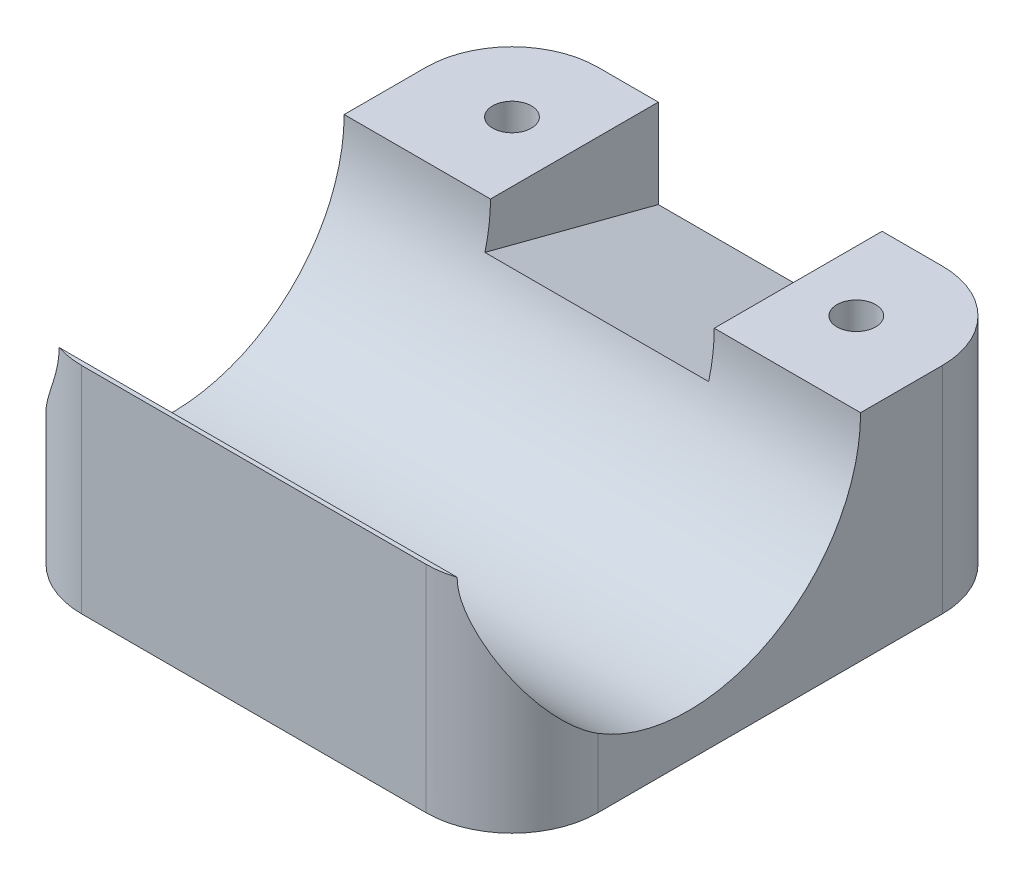
ISO-10303-21;
HEADER;
FILE_DESCRIPTION(('STEP AP214'),'2;1');
FILE_NAME('part.step','',(''),(''),'','','');
FILE_SCHEMA(('AUTOMOTIVE_DESIGN { 1 0 10303 214 1 1 1 1 }'));
ENDSEC;
DATA;
#1=APPLICATION_CONTEXT('core data for automotive mechanical design processes');
#2=APPLICATION_PROTOCOL_DEFINITION('international standard','automotive_design',2000,#1);
#3=PRODUCT_CONTEXT('',#1,'mechanical');
#4=PRODUCT('Part','Part','',(#3));
#5=PRODUCT_RELATED_PRODUCT_CATEGORY('part','',(#4));
#6=PRODUCT_DEFINITION_FORMATION('','',#4);
#7=PRODUCT_DEFINITION_CONTEXT('part definition',#1,'design');
#8=PRODUCT_DEFINITION('design','',#6,#7);
#9=PRODUCT_DEFINITION_SHAPE('','',#8);
#10=(LENGTH_UNIT() NAMED_UNIT(*) SI_UNIT(.MILLI.,.METRE.));
#11=(NAMED_UNIT(*) PLANE_ANGLE_UNIT() SI_UNIT($,.RADIAN.));
#12=(NAMED_UNIT(*) SI_UNIT($,.STERADIAN.) SOLID_ANGLE_UNIT());
#13=UNCERTAINTY_MEASURE_WITH_UNIT(LENGTH_MEASURE(1.E-05),#10,'distance_accuracy_value','');
#14=(GEOMETRIC_REPRESENTATION_CONTEXT(3) GLOBAL_UNCERTAINTY_ASSIGNED_CONTEXT((#13)) GLOBAL_UNIT_ASSIGNED_CONTEXT((#10,
#11,#12)) REPRESENTATION_CONTEXT('',''));
#15=CARTESIAN_POINT('',(0.,0.,0.));
#16=DIRECTION('',(0.,0.,1.));
#17=DIRECTION('',(1.,0.,0.));
#18=AXIS2_PLACEMENT_3D('',#15,#16,#17);
#19=CARTESIAN_POINT('',(0.,25.,0.));
#20=DIRECTION('',(0.,1.,0.));
#21=DIRECTION('',(-1.,0.,0.));
#22=AXIS2_PLACEMENT_3D('',#19,#20,#21);
#23=PLANE('',#22);
#24=CARTESIAN_POINT('',(50.,25.,-50.));
#25=DIRECTION('',(0.,1.,0.));
#26=DIRECTION('',(-1.,0.,0.));
#27=AXIS2_PLACEMENT_3D('',#24,#25,#26);
#28=CIRCLE('',#27,2.25);
#29=CARTESIAN_POINT('',(47.75,25.,-50.));
#30=VERTEX_POINT('',#29);
#31=EDGE_CURVE('E220',#30,#30,#28,.T.);
#32=ORIENTED_EDGE('',*,*,#31,.F.);
#33=EDGE_LOOP('',(#32));
#34=FACE_BOUND('',#33,.T.);
#35=DIRECTION('',(0.,0.,-1.));
#36=VECTOR('',#35,1.);
#37=CARTESIAN_POINT('',(60.,25.,0.));
#38=LINE('',#37,#36);
#39=CARTESIAN_POINT('',(60.,25.,-40.5000000000002));
#40=VERTEX_POINT('',#39);
#41=CARTESIAN_POINT('',(60.,25.,-50.));
#42=VERTEX_POINT('',#41);
#43=EDGE_CURVE('E250',#40,#42,#38,.T.);
#44=ORIENTED_EDGE('',*,*,#43,.T.);
#45=CARTESIAN_POINT('',(50.,25.,-50.));
#46=DIRECTION('',(0.,1.,0.));
#47=DIRECTION('',(-1.,0.,0.));
#48=AXIS2_PLACEMENT_3D('',#45,#46,#47);
#49=CIRCLE('',#48,10.);
#50=CARTESIAN_POINT('',(50.,25.,-60.));
#51=VERTEX_POINT('',#50);
#52=EDGE_CURVE('E56',#42,#51,#49,.T.);
#53=ORIENTED_EDGE('',*,*,#52,.T.);
#54=DIRECTION('',(-1.,0.,0.));
#55=VECTOR('',#54,1.);
#56=CARTESIAN_POINT('',(0.,25.,-60.));
#57=LINE('',#56,#55);
#58=CARTESIAN_POINT('',(43.,25.,-60.));
#59=VERTEX_POINT('',#58);
#60=EDGE_CURVE('E248',#51,#59,#57,.T.);
#61=ORIENTED_EDGE('',*,*,#60,.T.);
#62=DIRECTION('',(0.,0.,1.));
#63=VECTOR('',#62,1.);
#64=CARTESIAN_POINT('',(43.,25.,0.));
#65=LINE('',#64,#63);
#66=CARTESIAN_POINT('',(43.,25.,-40.5000000000002));
#67=VERTEX_POINT('',#66);
#68=EDGE_CURVE('E195',#59,#67,#65,.T.);
#69=ORIENTED_EDGE('',*,*,#68,.T.);
#70=DIRECTION('',(-1.,0.,0.));
#71=VECTOR('',#70,1.);
#72=CARTESIAN_POINT('',(111.219821336558,25.,-40.5000000000002));
#73=LINE('',#72,#71);
#74=EDGE_CURVE('E244',#40,#67,#73,.T.);
#75=ORIENTED_EDGE('',*,*,#74,.F.);
#76=EDGE_LOOP('',(#44,#53,#61,#69,#75));
#77=FACE_BOUND('',#76,.T.);
#78=ADVANCED_FACE('F46',(#34,#77),#23,.T.);
#79=CARTESIAN_POINT('',(10.,25.,-50.));
#80=DIRECTION('',(0.,1.,0.));
#81=DIRECTION('',(-1.,0.,0.));
#82=AXIS2_PLACEMENT_3D('',#79,#80,#81);
#83=CIRCLE('',#82,2.25);
#84=CARTESIAN_POINT('',(7.75,25.,-50.));
#85=VERTEX_POINT('',#84);
#86=EDGE_CURVE('E215',#85,#85,#83,.T.);
#87=ORIENTED_EDGE('',*,*,#86,.F.);
#88=EDGE_LOOP('',(#87));
#89=FACE_BOUND('',#88,.T.);
#90=CARTESIAN_POINT('',(17.,25.,-60.));
#91=VERTEX_POINT('',#90);
#92=CARTESIAN_POINT('',(10.,25.,-60.));
#93=VERTEX_POINT('',#92);
#94=EDGE_CURVE('E154',#91,#93,#57,.T.);
#95=ORIENTED_EDGE('',*,*,#94,.T.);
#96=CARTESIAN_POINT('',(10.,25.,-50.));
#97=DIRECTION('',(0.,1.,0.));
#98=DIRECTION('',(-1.,0.,0.));
#99=AXIS2_PLACEMENT_3D('',#96,#97,#98);
#100=CIRCLE('',#99,10.);
#101=CARTESIAN_POINT('',(0.,25.,-50.));
#102=VERTEX_POINT('',#101);
#103=EDGE_CURVE('E13',#93,#102,#100,.T.);
#104=ORIENTED_EDGE('',*,*,#103,.T.);
#105=DIRECTION('',(0.,0.,1.));
#106=VECTOR('',#105,1.);
#107=CARTESIAN_POINT('',(0.,25.,0.));
#108=LINE('',#107,#106);
#109=CARTESIAN_POINT('',(0.,25.,-40.5000000000002));
#110=VERTEX_POINT('',#109);
#111=EDGE_CURVE('E104',#102,#110,#108,.T.);
#112=ORIENTED_EDGE('',*,*,#111,.T.);
#113=CARTESIAN_POINT('',(17.,25.,-40.5000000000002));
#114=VERTEX_POINT('',#113);
#115=EDGE_CURVE('E247',#114,#110,#73,.T.);
#116=ORIENTED_EDGE('',*,*,#115,.F.);
#117=DIRECTION('',(0.,0.,1.));
#118=VECTOR('',#117,1.);
#119=CARTESIAN_POINT('',(17.,25.,0.));
#120=LINE('',#119,#118);
#121=EDGE_CURVE('E194',#91,#114,#120,.T.);
#122=ORIENTED_EDGE('',*,*,#121,.F.);
#123=EDGE_LOOP('',(#95,#104,#112,#116,#122));
#124=FACE_BOUND('',#123,.T.);
#125=ADVANCED_FACE('F151',(#89,#124),#23,.T.);
#126=DIRECTION('',(1.,0.,0.));
#127=VECTOR('',#126,1.);
#128=CARTESIAN_POINT('',(0.,25.,0.));
#129=LINE('',#128,#127);
#130=CARTESIAN_POINT('',(10.,25.,0.));
#131=VERTEX_POINT('',#130);
#132=CARTESIAN_POINT('',(50.,25.,0.));
#133=VERTEX_POINT('',#132);
#134=EDGE_CURVE('E167',#131,#133,#129,.T.);
#135=ORIENTED_EDGE('',*,*,#134,.T.);
#136=CARTESIAN_POINT('',(50.,25.,-10.));
#137=DIRECTION('',(0.,1.,0.));
#138=DIRECTION('',(-1.,0.,0.));
#139=AXIS2_PLACEMENT_3D('',#136,#137,#138);
#140=CIRCLE('',#139,10.);
#141=CARTESIAN_POINT('',(53.1224989991997,25.,-0.500000000000164));
#142=VERTEX_POINT('',#141);
#143=EDGE_CURVE('E275',#133,#142,#140,.T.);
#144=ORIENTED_EDGE('',*,*,#143,.T.);
#145=DIRECTION('',(-1.,0.,0.));
#146=VECTOR('',#145,1.);
#147=CARTESIAN_POINT('',(111.219821336558,25.,-0.500000000000164));
#148=LINE('',#147,#146);
#149=CARTESIAN_POINT('',(6.8775010008003,25.,-0.500000000000164));
#150=VERTEX_POINT('',#149);
#151=EDGE_CURVE('E240',#150,#142,#148,.F.);
#152=ORIENTED_EDGE('',*,*,#151,.F.);
#153=CARTESIAN_POINT('',(10.,25.,-10.));
#154=DIRECTION('',(0.,1.,0.));
#155=DIRECTION('',(-1.,0.,0.));
#156=AXIS2_PLACEMENT_3D('',#153,#154,#155);
#157=CIRCLE('',#156,10.);
#158=EDGE_CURVE('E273',#150,#131,#157,.T.);
#159=ORIENTED_EDGE('',*,*,#158,.T.);
#160=EDGE_LOOP('',(#135,#144,#152,#159));
#161=FACE_BOUND('',#160,.T.);
#162=ADVANCED_FACE('F307',(#161),#23,.T.);
#163=CARTESIAN_POINT('',(0.,80.,0.));
#164=DIRECTION('',(0.,0.,-1.));
#165=DIRECTION('',(-1.,0.,0.));
#166=AXIS2_PLACEMENT_3D('',#163,#164,#165);
#167=PLANE('',#166);
#168=DIRECTION('',(1.,0.,0.));
#169=VECTOR('',#168,1.);
#170=CARTESIAN_POINT('',(0.,0.,0.));
#171=LINE('',#170,#169);
#172=CARTESIAN_POINT('',(10.,0.,0.));
#173=VERTEX_POINT('',#172);
#174=CARTESIAN_POINT('',(50.,0.,0.));
#175=VERTEX_POINT('',#174);
#176=EDGE_CURVE('E231',#173,#175,#171,.T.);
#177=ORIENTED_EDGE('',*,*,#176,.T.);
#178=DIRECTION('',(0.,-1.,0.));
#179=VECTOR('',#178,1.);
#180=CARTESIAN_POINT('',(50.,80.,0.));
#181=LINE('',#180,#179);
#182=EDGE_CURVE('E271',#175,#133,#181,.F.);
#183=ORIENTED_EDGE('',*,*,#182,.T.);
#184=ORIENTED_EDGE('',*,*,#134,.F.);
#185=DIRECTION('',(0.,-1.,0.));
#186=VECTOR('',#185,1.);
#187=CARTESIAN_POINT('',(10.,80.,0.));
#188=LINE('',#187,#186);
#189=EDGE_CURVE('E268',#131,#173,#188,.T.);
#190=ORIENTED_EDGE('',*,*,#189,.T.);
#191=EDGE_LOOP('',(#177,#183,#184,#190));
#192=FACE_BOUND('',#191,.T.);
#193=ADVANCED_FACE('F311',(#192),#167,.F.);
#194=CARTESIAN_POINT('',(0.,0.,0.));
#195=DIRECTION('',(0.,-1.,0.));
#196=DIRECTION('',(0.,0.,-1.));
#197=AXIS2_PLACEMENT_3D('',#194,#195,#196);
#198=PLANE('',#197);
#199=CARTESIAN_POINT('',(9.99999999999999,0.,-50.));
#200=DIRECTION('',(0.,-1.,0.));
#201=DIRECTION('',(0.,0.,-1.));
#202=AXIS2_PLACEMENT_3D('',#199,#200,#201);
#203=CIRCLE('',#202,2.25);
#204=CARTESIAN_POINT('',(9.99999999999999,0.,-52.25));
#205=VERTEX_POINT('',#204);
#206=EDGE_CURVE('E50',#205,#205,#203,.T.);
#207=ORIENTED_EDGE('',*,*,#206,.F.);
#208=EDGE_LOOP('',(#207));
#209=FACE_BOUND('',#208,.T.);
#210=CARTESIAN_POINT('',(50.,0.,-50.));
#211=DIRECTION('',(0.,-1.,0.));
#212=DIRECTION('',(0.,0.,-1.));
#213=AXIS2_PLACEMENT_3D('',#210,#211,#212);
#214=CIRCLE('',#213,2.25);
#215=CARTESIAN_POINT('',(50.,0.,-52.25));
#216=VERTEX_POINT('',#215);
#217=EDGE_CURVE('E213',#216,#216,#214,.T.);
#218=ORIENTED_EDGE('',*,*,#217,.F.);
#219=EDGE_LOOP('',(#218));
#220=FACE_BOUND('',#219,.T.);
#221=DIRECTION('',(0.,0.,-1.));
#222=VECTOR('',#221,1.);
#223=CARTESIAN_POINT('',(60.,0.,0.));
#224=LINE('',#223,#222);
#225=CARTESIAN_POINT('',(60.,0.,-10.));
#226=VERTEX_POINT('',#225);
#227=CARTESIAN_POINT('',(60.,0.,-50.));
#228=VERTEX_POINT('',#227);
#229=EDGE_CURVE('E234',#226,#228,#224,.T.);
#230=ORIENTED_EDGE('',*,*,#229,.F.);
#231=CARTESIAN_POINT('',(50.,0.,-10.));
#232=DIRECTION('',(0.,-1.,0.));
#233=DIRECTION('',(0.,0.,-1.));
#234=AXIS2_PLACEMENT_3D('',#231,#232,#233);
#235=CIRCLE('',#234,10.);
#236=EDGE_CURVE('E266',#226,#175,#235,.T.);
#237=ORIENTED_EDGE('',*,*,#236,.T.);
#238=ORIENTED_EDGE('',*,*,#176,.F.);
#239=CARTESIAN_POINT('',(10.,0.,-10.));
#240=DIRECTION('',(0.,-1.,0.));
#241=DIRECTION('',(0.,0.,-1.));
#242=AXIS2_PLACEMENT_3D('',#239,#240,#241);
#243=CIRCLE('',#242,10.);
#244=CARTESIAN_POINT('',(0.,0.,-10.));
#245=VERTEX_POINT('',#244);
#246=EDGE_CURVE('E264',#173,#245,#243,.T.);
#247=ORIENTED_EDGE('',*,*,#246,.T.);
#248=DIRECTION('',(0.,0.,1.));
#249=VECTOR('',#248,1.);
#250=CARTESIAN_POINT('',(0.,0.,0.));
#251=LINE('',#250,#249);
#252=CARTESIAN_POINT('',(0.,0.,-50.));
#253=VERTEX_POINT('',#252);
#254=EDGE_CURVE('E229',#253,#245,#251,.T.);
#255=ORIENTED_EDGE('',*,*,#254,.F.);
#256=CARTESIAN_POINT('',(10.,0.,-50.));
#257=DIRECTION('',(0.,-1.,0.));
#258=DIRECTION('',(0.,0.,-1.));
#259=AXIS2_PLACEMENT_3D('',#256,#257,#258);
#260=CIRCLE('',#259,10.);
#261=CARTESIAN_POINT('',(10.,0.,-60.));
#262=VERTEX_POINT('',#261);
#263=EDGE_CURVE('E171',#253,#262,#260,.T.);
#264=ORIENTED_EDGE('',*,*,#263,.T.);
#265=DIRECTION('',(-1.,0.,0.));
#266=VECTOR('',#265,1.);
#267=CARTESIAN_POINT('',(0.,0.,-60.));
#268=LINE('',#267,#266);
#269=CARTESIAN_POINT('',(50.,0.,-60.));
#270=VERTEX_POINT('',#269);
#271=EDGE_CURVE('E237',#270,#262,#268,.T.);
#272=ORIENTED_EDGE('',*,*,#271,.F.);
#273=CARTESIAN_POINT('',(50.,0.,-50.));
#274=DIRECTION('',(0.,-1.,0.));
#275=DIRECTION('',(0.,0.,-1.));
#276=AXIS2_PLACEMENT_3D('',#273,#274,#275);
#277=CIRCLE('',#276,10.);
#278=EDGE_CURVE('E262',#270,#228,#277,.T.);
#279=ORIENTED_EDGE('',*,*,#278,.T.);
#280=EDGE_LOOP('',(#230,#237,#238,#247,#255,#264,#272,#279));
#281=FACE_BOUND('',#280,.T.);
#282=ADVANCED_FACE('F322',(#209,#220,#281),#198,.T.);
#283=CARTESIAN_POINT('',(0.,80.,-60.));
#284=DIRECTION('',(0.,0.,1.));
#285=DIRECTION('',(1.,0.,0.));
#286=AXIS2_PLACEMENT_3D('',#283,#284,#285);
#287=PLANE('',#286);
#288=ORIENTED_EDGE('',*,*,#60,.F.);
#289=DIRECTION('',(0.,-1.,0.));
#290=VECTOR('',#289,1.);
#291=CARTESIAN_POINT('',(50.,80.,-60.));
#292=LINE('',#291,#290);
#293=EDGE_CURVE('E188',#51,#270,#292,.T.);
#294=ORIENTED_EDGE('',*,*,#293,.T.);
#295=ORIENTED_EDGE('',*,*,#271,.T.);
#296=DIRECTION('',(0.,-1.,0.));
#297=VECTOR('',#296,1.);
#298=CARTESIAN_POINT('',(10.,80.,-60.));
#299=LINE('',#298,#297);
#300=EDGE_CURVE('E175',#262,#93,#299,.F.);
#301=ORIENTED_EDGE('',*,*,#300,.T.);
#302=ORIENTED_EDGE('',*,*,#94,.F.);
#303=DIRECTION('',(0.,-1.,0.));
#304=VECTOR('',#303,1.);
#305=CARTESIAN_POINT('',(17.,80.,-60.));
#306=LINE('',#305,#304);
#307=CARTESIAN_POINT('',(17.,14.6878764002385,-60.0000000000001));
#308=VERTEX_POINT('',#307);
#309=EDGE_CURVE('E168',#91,#308,#306,.T.);
#310=ORIENTED_EDGE('',*,*,#309,.T.);
#311=DIRECTION('',(1.,0.,0.));
#312=VECTOR('',#311,1.);
#313=CARTESIAN_POINT('',(0.,14.6878764002385,-60.0000000000001));
#314=LINE('',#313,#312);
#315=CARTESIAN_POINT('',(43.,14.6878764002385,-60.0000000000001));
#316=VERTEX_POINT('',#315);
#317=EDGE_CURVE('E206',#308,#316,#314,.T.);
#318=ORIENTED_EDGE('',*,*,#317,.T.);
#319=DIRECTION('',(0.,-1.,0.));
#320=VECTOR('',#319,1.);
#321=CARTESIAN_POINT('',(43.,80.,-60.));
#322=LINE('',#321,#320);
#323=EDGE_CURVE('E192',#59,#316,#322,.T.);
#324=ORIENTED_EDGE('',*,*,#323,.F.);
#325=EDGE_LOOP('',(#288,#294,#295,#301,#302,#310,#318,#324));
#326=FACE_BOUND('',#325,.T.);
#327=ADVANCED_FACE('F328',(#326),#287,.F.);
#328=CARTESIAN_POINT('',(0.,80.,0.));
#329=DIRECTION('',(1.,0.,0.));
#330=DIRECTION('',(0.,0.,-1.));
#331=AXIS2_PLACEMENT_3D('',#328,#329,#330);
#332=PLANE('',#331);
#333=ORIENTED_EDGE('',*,*,#254,.T.);
#334=DIRECTION('',(0.,-1.,0.));
#335=VECTOR('',#334,1.);
#336=CARTESIAN_POINT('',(0.,80.,-10.));
#337=LINE('',#336,#335);
#338=CARTESIAN_POINT('',(0.,7.97795546945087,-10.));
#339=VERTEX_POINT('',#338);
#340=EDGE_CURVE('E172',#245,#339,#337,.F.);
#341=ORIENTED_EDGE('',*,*,#340,.T.);
#342=CARTESIAN_POINT('',(0.,25.,-20.5000000000002));
#343=DIRECTION('',(1.,0.,0.));
#344=DIRECTION('',(0.,0.,-1.));
#345=AXIS2_PLACEMENT_3D('',#342,#343,#344);
#346=CIRCLE('',#345,20.);
#347=EDGE_CURVE('E166',#110,#339,#346,.F.);
#348=ORIENTED_EDGE('',*,*,#347,.F.);
#349=ORIENTED_EDGE('',*,*,#111,.F.);
#350=DIRECTION('',(0.,-1.,0.));
#351=VECTOR('',#350,1.);
#352=CARTESIAN_POINT('',(0.,80.,-50.));
#353=LINE('',#352,#351);
#354=EDGE_CURVE('E163',#102,#253,#353,.T.);
#355=ORIENTED_EDGE('',*,*,#354,.T.);
#356=EDGE_LOOP('',(#333,#341,#348,#349,#355));
#357=FACE_BOUND('',#356,.T.);
#358=ADVANCED_FACE('F162',(#357),#332,.F.);
#359=CARTESIAN_POINT('',(60.,80.,0.));
#360=DIRECTION('',(-1.,0.,0.));
#361=DIRECTION('',(0.,0.,1.));
#362=AXIS2_PLACEMENT_3D('',#359,#360,#361);
#363=PLANE('',#362);
#364=CARTESIAN_POINT('',(60.,25.,-20.5000000000002));
#365=DIRECTION('',(-1.,0.,0.));
#366=DIRECTION('',(0.,0.,1.));
#367=AXIS2_PLACEMENT_3D('',#364,#365,#366);
#368=CIRCLE('',#367,20.);
#369=CARTESIAN_POINT('',(60.,7.97795546945087,-10.));
#370=VERTEX_POINT('',#369);
#371=EDGE_CURVE('E243',#370,#40,#368,.F.);
#372=ORIENTED_EDGE('',*,*,#371,.F.);
#373=DIRECTION('',(0.,-1.,0.));
#374=VECTOR('',#373,1.);
#375=CARTESIAN_POINT('',(60.,80.,-10.));
#376=LINE('',#375,#374);
#377=EDGE_CURVE('E258',#370,#226,#376,.T.);
#378=ORIENTED_EDGE('',*,*,#377,.T.);
#379=ORIENTED_EDGE('',*,*,#229,.T.);
#380=DIRECTION('',(0.,-1.,0.));
#381=VECTOR('',#380,1.);
#382=CARTESIAN_POINT('',(60.,80.,-50.));
#383=LINE('',#382,#381);
#384=EDGE_CURVE('E212',#228,#42,#383,.F.);
#385=ORIENTED_EDGE('',*,*,#384,.T.);
#386=ORIENTED_EDGE('',*,*,#43,.F.);
#387=EDGE_LOOP('',(#372,#378,#379,#385,#386));
#388=FACE_BOUND('',#387,.T.);
#389=ADVANCED_FACE('F331',(#388),#363,.F.);
#390=CARTESIAN_POINT('',(111.219821336558,25.,-20.5000000000002));
#391=DIRECTION('',(-1.,0.,0.));
#392=DIRECTION('',(0.,-1.,0.));
#393=AXIS2_PLACEMENT_3D('',#390,#391,#392);
#394=CYLINDRICAL_SURFACE('',#393,20.);
#395=ORIENTED_EDGE('',*,*,#151,.T.);
#396=CARTESIAN_POINT('',(53.1224989991997,25.,-0.500000000000164));
#397=CARTESIAN_POINT('',(53.1224708069098,24.8800449396564,-0.499997099524372));
#398=CARTESIAN_POINT('',(53.1257848064719,24.7601191912737,-0.501079539099466));
#399=CARTESIAN_POINT('',(53.138849860528,24.5207153621599,-0.505385969860262));
#400=CARTESIAN_POINT('',(53.148597702406,24.4012370879195,-0.508608892241866));
#401=CARTESIAN_POINT('',(53.1869981686133,24.0450671564395,-0.521403612885036));
#402=CARTESIAN_POINT('',(53.2248126649671,23.8094357437672,-0.534102011813366));
#403=CARTESIAN_POINT('',(53.320107126085,23.3467877387108,-0.567114233831709));
#404=CARTESIAN_POINT('',(53.3772696369701,23.1196940104969,-0.587305601042217));
#405=CARTESIAN_POINT('',(53.5069497604323,22.6704462274062,-0.634847789501607));
#406=CARTESIAN_POINT('',(53.5794885831991,22.4482994690272,-0.662208512648393));
#407=CARTESIAN_POINT('',(53.7531612461414,21.9604434370341,-0.73046555695193));
#408=CARTESIAN_POINT('',(53.8570709817435,21.695968253138,-0.773017223259339));
#409=CARTESIAN_POINT('',(54.0761627575001,21.1734143058796,-0.867685337335873));
#410=CARTESIAN_POINT('',(54.191350509824,20.9153388677038,-0.919806643822752));
#411=CARTESIAN_POINT('',(54.4291583017033,20.4043523179879,-1.03339785428848));
#412=CARTESIAN_POINT('',(54.5517875238087,20.1514481238226,-1.09487945570775));
#413=CARTESIAN_POINT('',(54.8015056770854,19.6503619401781,-1.22700112208476));
#414=CARTESIAN_POINT('',(54.9285937563367,19.4021790624574,-1.29763944441233));
#415=CARTESIAN_POINT('',(55.1873384820379,18.9057822146865,-1.44930513848881));
#416=CARTESIAN_POINT('',(55.3190359581645,18.6576364001741,-1.53048577972134));
#417=CARTESIAN_POINT('',(55.5833190696419,18.1651342927833,-1.70232438850521));
#418=CARTESIAN_POINT('',(55.7159047401875,17.9207781513584,-1.79298273371616));
#419=CARTESIAN_POINT('',(56.1127798957772,17.193383218963,-2.0791339964841));
#420=CARTESIAN_POINT('',(56.3764429959337,16.7155393215494,-2.28894948215647));
#421=CARTESIAN_POINT('',(56.9057335985074,15.7515783066907,-2.75832304494689));
#422=CARTESIAN_POINT('',(57.1708878680394,15.2661008424089,-3.01973303649547));
#423=CARTESIAN_POINT('',(57.6823458465598,14.310911099672,-3.58693099935966));
#424=CARTESIAN_POINT('',(57.9286424786273,13.8412047766016,-3.89273550763648));
#425=CARTESIAN_POINT('',(58.3913720856985,12.9256264874115,-4.54624621390274));
#426=CARTESIAN_POINT('',(58.6081118118888,12.4795447667695,-4.89343838425959));
#427=CARTESIAN_POINT('',(59.0059346271474,11.6096139140556,-5.63315841313272));
#428=CARTESIAN_POINT('',(59.1870403174509,11.1857508155858,-6.02565728311338));
#429=CARTESIAN_POINT('',(59.4445820829312,10.5174187834365,-6.70181405427131));
#430=CARTESIAN_POINT('',(59.5349503181818,10.2646110597132,-6.97199623278457));
#431=CARTESIAN_POINT('',(59.6943400469839,9.7716573727544,-7.52942284906414));
#432=CARTESIAN_POINT('',(59.7633757756132,9.53150305511052,-7.81665575572737));
#433=CARTESIAN_POINT('',(59.8776640102811,9.06248442358219,-8.41113404115583));
#434=CARTESIAN_POINT('',(59.9225966340822,8.83380680342549,-8.71859056513784));
#435=CARTESIAN_POINT('',(59.9684774242142,8.50326042475789,-9.1909473348962));
#436=CARTESIAN_POINT('',(59.9801856254673,8.39504801661253,-9.3504374954966));
#437=CARTESIAN_POINT('',(59.9959475879986,8.18308667390829,-9.67278113757956));
#438=CARTESIAN_POINT('',(59.9999994427996,8.07933885734321,-9.83563544655295));
#439=CARTESIAN_POINT('',(60.,7.97795546945087,-10.));
#440=B_SPLINE_CURVE_WITH_KNOTS('',3,(#396,#397,#398,#399,#400,#401,#402,#403,#404,#405,#406,
#407,#408,#409,#410,#411,#412,#413,#414,#415,#416,#417,#418,#419,#420,#421,#422,#423,#424,#425,
#426,#427,#428,#429,#430,#431,#432,#433,#434,#435,#436,#437,#438,#439),.UNSPECIFIED.,.F.,.F.,(4,
2,2,2,2,2,2,2,2,2,2,2,2,2,2,2,2,2,2,2,2,4),(0.,0.359761175416661,0.719342846744263,
1.43491289479676,2.13926959363296,2.84460428416584,3.70596676316799,4.56776779041089,
5.43065477627449,6.29337778517302,7.17045164517021,8.04756046740296,9.80009602699582,
11.6336937522066,13.4679762536689,15.2814753690126,17.0938205205277,18.2354604139952,
19.376336843348,20.53200154388,21.111069156897,21.6902809423152),.UNSPECIFIED.);
#441=EDGE_CURVE('E173',#142,#370,#440,.T.);
#442=ORIENTED_EDGE('',*,*,#441,.T.);
#443=ORIENTED_EDGE('',*,*,#371,.T.);
#444=ORIENTED_EDGE('',*,*,#74,.T.);
#445=CARTESIAN_POINT('',(43.,25.,-20.5000000000002));
#446=DIRECTION('',(-1.,0.,0.));
#447=DIRECTION('',(0.,0.,1.));
#448=AXIS2_PLACEMENT_3D('',#445,#446,#447);
#449=CIRCLE('',#448,20.);
#450=CARTESIAN_POINT('',(43.,19.9479954438074,-39.8514146760442));
#451=VERTEX_POINT('',#450);
#452=EDGE_CURVE('E199',#67,#451,#449,.T.);
#453=ORIENTED_EDGE('',*,*,#452,.T.);
#454=DIRECTION('',(-1.,0.,0.));
#455=VECTOR('',#454,1.);
#456=CARTESIAN_POINT('',(111.219821336558,19.9479954438074,-39.8514146760442));
#457=LINE('',#456,#455);
#458=CARTESIAN_POINT('',(17.,19.9479954438074,-39.8514146760442));
#459=VERTEX_POINT('',#458);
#460=EDGE_CURVE('E203',#459,#451,#457,.F.);
#461=ORIENTED_EDGE('',*,*,#460,.F.);
#462=CARTESIAN_POINT('',(17.,25.,-20.5000000000002));
#463=DIRECTION('',(-1.,0.,0.));
#464=DIRECTION('',(0.,0.,1.));
#465=AXIS2_PLACEMENT_3D('',#462,#463,#464);
#466=CIRCLE('',#465,20.);
#467=EDGE_CURVE('E202',#114,#459,#466,.T.);
#468=ORIENTED_EDGE('',*,*,#467,.F.);
#469=ORIENTED_EDGE('',*,*,#115,.T.);
#470=ORIENTED_EDGE('',*,*,#347,.T.);
#471=CARTESIAN_POINT('',(0.,7.97795546945087,-10.));
#472=CARTESIAN_POINT('',(-1.75599335214441E-06,8.09116246814899,-9.81645643927052));
#473=CARTESIAN_POINT('',(0.00505271509514919,8.20733678767391,-9.63478196439833));
#474=CARTESIAN_POINT('',(0.0246460777122884,8.44520777253347,-9.27569074853738));
#475=CARTESIAN_POINT('',(0.0391817558970379,8.56690255389161,-9.09827258612512));
#476=CARTESIAN_POINT('',(0.0770654754524586,8.81518529946211,-8.74850285804101));
#477=CARTESIAN_POINT('',(0.10039258532687,8.94176100511569,-8.57614029794471));
#478=CARTESIAN_POINT('',(0.155241270774667,9.19970815782022,-8.23638333705419));
#479=CARTESIAN_POINT('',(0.186763557502488,9.33108002021733,-8.06898936882568));
#480=CARTESIAN_POINT('',(0.291863569013039,9.72864417275586,-7.57865322441322));
#481=CARTESIAN_POINT('',(0.376470436438151,10.0013445338556,-7.26325994284696));
#482=CARTESIAN_POINT('',(0.570916148299512,10.561719059377,-6.65414831752449));
#483=CARTESIAN_POINT('',(0.680773021410957,10.849403808698,-6.36044565995834));
#484=CARTESIAN_POINT('',(0.950486591292431,11.5078043771608,-5.72786945884866));
#485=CARTESIAN_POINT('',(1.11601834654412,11.8819368989309,-5.39496771731035));
#486=CARTESIAN_POINT('',(1.47289462404038,12.6464074255625,-4.76358683673927));
#487=CARTESIAN_POINT('',(1.66424236526344,13.0367474471183,-4.46511199899739));
#488=CARTESIAN_POINT('',(2.06795249917022,13.8332281043146,-3.90051998974579));
#489=CARTESIAN_POINT('',(2.28041894376969,14.2394403173534,-3.63457905523823));
#490=CARTESIAN_POINT('',(2.7201295630743,15.0639500820444,-3.13604246607942));
#491=CARTESIAN_POINT('',(2.94737178362187,15.4822460315225,-2.90344241494444));
#492=CARTESIAN_POINT('',(3.42140716550456,16.3482545635878,-2.46132623721641));
#493=CARTESIAN_POINT('',(3.66862084511318,16.7964590259091,-2.25323020042944));
#494=CARTESIAN_POINT('',(4.16719703829204,17.7053225152938,-1.87123285651389));
#495=CARTESIAN_POINT('',(4.41856156469492,18.1659876582625,-1.69734870070593));
#496=CARTESIAN_POINT('',(4.79203606525779,18.8671323618519,-1.46191794978746));
#497=CARTESIAN_POINT('',(4.91590504644134,19.1024849858627,-1.38768729361143));
#498=CARTESIAN_POINT('',(5.16096089420754,19.5770522443456,-1.24765289192623));
#499=CARTESIAN_POINT('',(5.28214802886943,19.8162664886354,-1.18184830096557));
#500=CARTESIAN_POINT('',(5.51979172204748,20.298885375396,-1.05876861070149));
#501=CARTESIAN_POINT('',(5.63625305846379,20.5422854124457,-1.00148473218218));
#502=CARTESIAN_POINT('',(5.86195396832604,21.0343286086826,-0.895490210229829));
#503=CARTESIAN_POINT('',(5.97119269278179,21.2829723797357,-0.846780573551146));
#504=CARTESIAN_POINT('',(6.16547833060777,21.7542675570263,-0.763867583324739));
#505=CARTESIAN_POINT('',(6.25183360519979,21.976188093344,-0.728606354486164));
#506=CARTESIAN_POINT('',(6.41281614727657,22.425173415362,-0.665141019468733));
#507=CARTESIAN_POINT('',(6.4874496744994,22.6522353807575,-0.636933141806517));
#508=CARTESIAN_POINT('',(6.62034348091012,23.1103090142971,-0.58815048394043));
#509=CARTESIAN_POINT('',(6.67871142539074,23.3412834266727,-0.567525207671294));
#510=CARTESIAN_POINT('',(6.77492691861903,23.8079427528553,-0.534190506615178));
#511=CARTESIAN_POINT('',(6.81279771929525,24.0436220133313,-0.521472109830416));
#512=CARTESIAN_POINT('',(6.85128047122396,24.3998833347696,-0.508649250117582));
#513=CARTESIAN_POINT('',(6.86105547003095,24.519402642593,-0.505417234951115));
#514=CARTESIAN_POINT('',(6.87419187274744,24.759270458224,-0.501087195616102));
#515=CARTESIAN_POINT('',(6.87752957112413,24.8796203991316,-0.499997058697327));
#516=CARTESIAN_POINT('',(6.87750100080031,25.,-0.500000000000162));
#517=B_SPLINE_CURVE_WITH_KNOTS('',3,(#471,#472,#473,#474,#475,#476,#477,#478,#479,#480,#481,
#482,#483,#484,#485,#486,#487,#488,#489,#490,#491,#492,#493,#494,#495,#496,#497,#498,#499,#500,
#501,#502,#503,#504,#505,#506,#507,#508,#509,#510,#511,#512,#513,#514,#515,#516),.UNSPECIFIED.,
.F.,.F.,(4,2,2,2,2,2,2,2,2,2,2,2,2,2,2,2,2,2,2,2,2,2,4),(0.,0.646807356513786,1.29339561273095,
1.93845403568268,2.583568453688,3.85796946617699,5.13328325195667,6.71327718306511,
8.29346830497756,9.88187224880654,11.4700665452471,13.1264574610886,14.7836766653973,
15.6119181385234,16.4400764426272,17.267375463345,18.094771557619,18.8166109636184,
19.538063566941,20.2546207080435,20.9703632749873,21.3300747541485,21.6911083701211),.UNSPECIFIED.);
#518=EDGE_CURVE('E177',#339,#150,#517,.T.);
#519=ORIENTED_EDGE('',*,*,#518,.T.);
#520=EDGE_LOOP('',(#395,#442,#443,#444,#453,#461,#468,#469,#470,#519));
#521=FACE_BOUND('',#520,.T.);
#522=ADVANCED_FACE('F281',(#521),#394,.F.);
#523=CARTESIAN_POINT('',(17.,40.993623711689,-10.7020585953681));
#524=DIRECTION('',(-1.,0.,0.));
#525=DIRECTION('',(0.,0.,1.));
#526=AXIS2_PLACEMENT_3D('',#523,#524,#525);
#527=PLANE('',#526);
#528=ORIENTED_EDGE('',*,*,#121,.T.);
#529=ORIENTED_EDGE('',*,*,#467,.T.);
#530=DIRECTION('',(0.,-0.25260022780962,-0.9675707338022));
#531=VECTOR('',#530,1.);
#532=CARTESIAN_POINT('',(17.,28.4152041722604,-7.41825563384306));
#533=LINE('',#532,#531);
#534=EDGE_CURVE('E94',#459,#308,#533,.T.);
#535=ORIENTED_EDGE('',*,*,#534,.T.);
#536=ORIENTED_EDGE('',*,*,#309,.F.);
#537=EDGE_LOOP('',(#528,#529,#535,#536));
#538=FACE_BOUND('',#537,.T.);
#539=ADVANCED_FACE('F48',(#538),#527,.F.);
#540=CARTESIAN_POINT('',(43.,40.993623711689,-10.7020585953681));
#541=DIRECTION('',(-1.,0.,0.));
#542=DIRECTION('',(0.,0.,1.));
#543=AXIS2_PLACEMENT_3D('',#540,#541,#542);
#544=PLANE('',#543);
#545=ORIENTED_EDGE('',*,*,#323,.T.);
#546=DIRECTION('',(0.,-0.25260022780962,-0.9675707338022));
#547=VECTOR('',#546,1.);
#548=CARTESIAN_POINT('',(43.,28.4152041722604,-7.41825563384305));
#549=LINE('',#548,#547);
#550=EDGE_CURVE('E198',#451,#316,#549,.T.);
#551=ORIENTED_EDGE('',*,*,#550,.F.);
#552=ORIENTED_EDGE('',*,*,#452,.F.);
#553=ORIENTED_EDGE('',*,*,#68,.F.);
#554=EDGE_LOOP('',(#545,#551,#552,#553));
#555=FACE_BOUND('',#554,.T.);
#556=ADVANCED_FACE('F297',(#555),#544,.T.);
#557=CARTESIAN_POINT('',(0.,28.4152041722604,-7.41825563384306));
#558=DIRECTION('',(0.,-0.9675707338022,0.25260022780962));
#559=DIRECTION('',(0.,-0.25260022780962,-0.9675707338022));
#560=AXIS2_PLACEMENT_3D('',#557,#558,#559);
#561=PLANE('',#560);
#562=ORIENTED_EDGE('',*,*,#460,.T.);
#563=ORIENTED_EDGE('',*,*,#550,.T.);
#564=ORIENTED_EDGE('',*,*,#317,.F.);
#565=ORIENTED_EDGE('',*,*,#534,.F.);
#566=EDGE_LOOP('',(#562,#563,#564,#565));
#567=FACE_BOUND('',#566,.T.);
#568=ADVANCED_FACE('F299',(#567),#561,.F.);
#569=CARTESIAN_POINT('',(50.,80.,-10.));
#570=DIRECTION('',(0.,-1.,0.));
#571=DIRECTION('',(0.,0.,-1.));
#572=AXIS2_PLACEMENT_3D('',#569,#570,#571);
#573=CYLINDRICAL_SURFACE('',#572,10.);
#574=ORIENTED_EDGE('',*,*,#143,.F.);
#575=ORIENTED_EDGE('',*,*,#182,.F.);
#576=ORIENTED_EDGE('',*,*,#236,.F.);
#577=ORIENTED_EDGE('',*,*,#377,.F.);
#578=ORIENTED_EDGE('',*,*,#441,.F.);
#579=EDGE_LOOP('',(#574,#575,#576,#577,#578));
#580=FACE_BOUND('',#579,.T.);
#581=ADVANCED_FACE('F289',(#580),#573,.T.);
#582=CARTESIAN_POINT('',(10.,80.,-10.));
#583=DIRECTION('',(0.,-1.,0.));
#584=DIRECTION('',(0.,0.,-1.));
#585=AXIS2_PLACEMENT_3D('',#582,#583,#584);
#586=CYLINDRICAL_SURFACE('',#585,10.);
#587=ORIENTED_EDGE('',*,*,#518,.F.);
#588=ORIENTED_EDGE('',*,*,#340,.F.);
#589=ORIENTED_EDGE('',*,*,#246,.F.);
#590=ORIENTED_EDGE('',*,*,#189,.F.);
#591=ORIENTED_EDGE('',*,*,#158,.F.);
#592=EDGE_LOOP('',(#587,#588,#589,#590,#591));
#593=FACE_BOUND('',#592,.T.);
#594=ADVANCED_FACE('F284',(#593),#586,.T.);
#595=CARTESIAN_POINT('',(50.,80.,-50.));
#596=DIRECTION('',(0.,-1.,0.));
#597=DIRECTION('',(0.,0.,-1.));
#598=AXIS2_PLACEMENT_3D('',#595,#596,#597);
#599=CYLINDRICAL_SURFACE('',#598,10.);
#600=ORIENTED_EDGE('',*,*,#52,.F.);
#601=ORIENTED_EDGE('',*,*,#384,.F.);
#602=ORIENTED_EDGE('',*,*,#278,.F.);
#603=ORIENTED_EDGE('',*,*,#293,.F.);
#604=EDGE_LOOP('',(#600,#601,#602,#603));
#605=FACE_BOUND('',#604,.T.);
#606=ADVANCED_FACE('F288',(#605),#599,.T.);
#607=CARTESIAN_POINT('',(10.,80.,-50.));
#608=DIRECTION('',(0.,-1.,0.));
#609=DIRECTION('',(0.,0.,-1.));
#610=AXIS2_PLACEMENT_3D('',#607,#608,#609);
#611=CYLINDRICAL_SURFACE('',#610,10.);
#612=ORIENTED_EDGE('',*,*,#103,.F.);
#613=ORIENTED_EDGE('',*,*,#300,.F.);
#614=ORIENTED_EDGE('',*,*,#263,.F.);
#615=ORIENTED_EDGE('',*,*,#354,.F.);
#616=EDGE_LOOP('',(#612,#613,#614,#615));
#617=FACE_BOUND('',#616,.T.);
#618=ADVANCED_FACE('F170',(#617),#611,.T.);
#619=CARTESIAN_POINT('',(50.,-2.99999999999998,-50.));
#620=DIRECTION('',(0.,1.,0.));
#621=DIRECTION('',(-1.,0.,0.));
#622=AXIS2_PLACEMENT_3D('',#619,#620,#621);
#623=CYLINDRICAL_SURFACE('',#622,2.25);
#624=ORIENTED_EDGE('',*,*,#217,.T.);
#625=EDGE_LOOP('',(#624));
#626=FACE_BOUND('',#625,.T.);
#627=ORIENTED_EDGE('',*,*,#31,.T.);
#628=EDGE_LOOP('',(#627));
#629=FACE_BOUND('',#628,.T.);
#630=ADVANCED_FACE('F296',(#626,#629),#623,.F.);
#631=CARTESIAN_POINT('',(9.99999999999999,-2.99999999999997,-50.));
#632=DIRECTION('',(0.,1.,0.));
#633=DIRECTION('',(-1.,0.,0.));
#634=AXIS2_PLACEMENT_3D('',#631,#632,#633);
#635=CYLINDRICAL_SURFACE('',#634,2.25);
#636=ORIENTED_EDGE('',*,*,#206,.T.);
#637=EDGE_LOOP('',(#636));
#638=FACE_BOUND('',#637,.T.);
#639=ORIENTED_EDGE('',*,*,#86,.T.);
#640=EDGE_LOOP('',(#639));
#641=FACE_BOUND('',#640,.T.);
#642=ADVANCED_FACE('F423',(#638,#641),#635,.F.);
#643=CLOSED_SHELL('',(#78,#125,#162,#193,#282,#327,#358,#389,#522,#539,#556,#568,#581,#594,#606,
#618,#630,#642));
#644=MANIFOLD_SOLID_BREP('B2',#643);
#645=ADVANCED_BREP_SHAPE_REPRESENTATION('',(#18,#644),#14);
#646=SHAPE_DEFINITION_REPRESENTATION(#9,#645);
ENDSEC;
END-ISO-10303-21;
